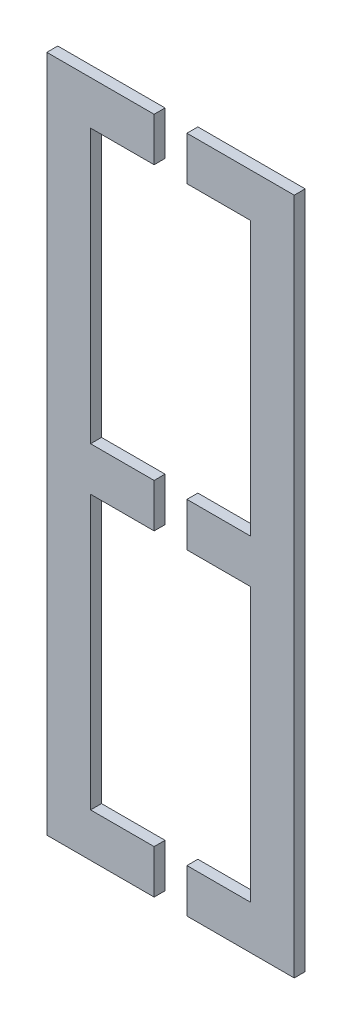
ISO-10303-21;
HEADER;
FILE_DESCRIPTION(('STEP AP214'),'2;1');
FILE_NAME('part.step','',(''),(''),'','','');
FILE_SCHEMA(('AUTOMOTIVE_DESIGN { 1 0 10303 214 1 1 1 1 }'));
ENDSEC;
DATA;
#1=APPLICATION_CONTEXT('core data for automotive mechanical design processes');
#2=APPLICATION_PROTOCOL_DEFINITION('international standard','automotive_design',2000,#1);
#3=PRODUCT_CONTEXT('',#1,'mechanical');
#4=PRODUCT('Part','Part','',(#3));
#5=PRODUCT_RELATED_PRODUCT_CATEGORY('part','',(#4));
#6=PRODUCT_DEFINITION_FORMATION('','',#4);
#7=PRODUCT_DEFINITION_CONTEXT('part definition',#1,'design');
#8=PRODUCT_DEFINITION('design','',#6,#7);
#9=PRODUCT_DEFINITION_SHAPE('','',#8);
#10=(LENGTH_UNIT() NAMED_UNIT(*) SI_UNIT(.MILLI.,.METRE.));
#11=(NAMED_UNIT(*) PLANE_ANGLE_UNIT() SI_UNIT($,.RADIAN.));
#12=(NAMED_UNIT(*) SI_UNIT($,.STERADIAN.) SOLID_ANGLE_UNIT());
#13=UNCERTAINTY_MEASURE_WITH_UNIT(LENGTH_MEASURE(1.E-05),#10,'distance_accuracy_value','');
#14=(GEOMETRIC_REPRESENTATION_CONTEXT(3) GLOBAL_UNCERTAINTY_ASSIGNED_CONTEXT((#13)) GLOBAL_UNIT_ASSIGNED_CONTEXT((#10,
#11,#12)) REPRESENTATION_CONTEXT('',''));
#15=CARTESIAN_POINT('',(0.,0.,0.));
#16=DIRECTION('',(0.,0.,1.));
#17=DIRECTION('',(1.,0.,0.));
#18=AXIS2_PLACEMENT_3D('',#15,#16,#17);
#19=CARTESIAN_POINT('',(118.250000228,184.12500005,6.35));
#20=DIRECTION('',(0.,1.,0.));
#21=DIRECTION('',(0.,0.,1.));
#22=AXIS2_PLACEMENT_3D('',#19,#20,#21);
#23=PLANE('',#22);
#24=DIRECTION('',(1.,0.,0.));
#25=VECTOR('',#24,1.);
#26=CARTESIAN_POINT('',(118.250000228,184.12500005,0.));
#27=LINE('',#26,#25);
#28=CARTESIAN_POINT('',(81.350000114,184.12500005,0.));
#29=VERTEX_POINT('',#28);
#30=CARTESIAN_POINT('',(118.250000228,184.12500005,0.));
#31=VERTEX_POINT('',#30);
#32=EDGE_CURVE('E163',#29,#31,#27,.T.);
#33=ORIENTED_EDGE('',*,*,#32,.T.);
#34=DIRECTION('',(0.,0.,-1.));
#35=VECTOR('',#34,1.);
#36=CARTESIAN_POINT('',(118.250000228,184.12500005,6.35));
#37=LINE('',#36,#35);
#38=CARTESIAN_POINT('',(118.250000228,184.12500005,6.35));
#39=VERTEX_POINT('',#38);
#40=EDGE_CURVE('E12',#39,#31,#37,.T.);
#41=ORIENTED_EDGE('',*,*,#40,.F.);
#42=DIRECTION('',(1.,0.,0.));
#43=VECTOR('',#42,1.);
#44=CARTESIAN_POINT('',(118.250000228,184.12500005,6.35));
#45=LINE('',#44,#43);
#46=CARTESIAN_POINT('',(81.350000114,184.12500005,6.35));
#47=VERTEX_POINT('',#46);
#48=EDGE_CURVE('E185',#47,#39,#45,.T.);
#49=ORIENTED_EDGE('',*,*,#48,.F.);
#50=DIRECTION('',(0.,0.,-1.));
#51=VECTOR('',#50,1.);
#52=CARTESIAN_POINT('',(81.350000114,184.12500005,6.35));
#53=LINE('',#52,#51);
#54=EDGE_CURVE('E159',#47,#29,#53,.T.);
#55=ORIENTED_EDGE('',*,*,#54,.T.);
#56=EDGE_LOOP('',(#33,#41,#49,#55));
#57=FACE_BOUND('',#56,.T.);
#58=ADVANCED_FACE('F43',(#57),#23,.F.);
#59=CARTESIAN_POINT('',(118.250000228,25.4,6.35));
#60=DIRECTION('',(1.,0.,0.));
#61=DIRECTION('',(0.,0.,-1.));
#62=AXIS2_PLACEMENT_3D('',#59,#60,#61);
#63=PLANE('',#62);
#64=DIRECTION('',(0.,-1.,0.));
#65=VECTOR('',#64,1.);
#66=CARTESIAN_POINT('',(118.250000228,25.4,0.));
#67=LINE('',#66,#65);
#68=CARTESIAN_POINT('',(118.250000228,25.4,0.));
#69=VERTEX_POINT('',#68);
#70=EDGE_CURVE('E166',#31,#69,#67,.T.);
#71=ORIENTED_EDGE('',*,*,#70,.T.);
#72=DIRECTION('',(0.,0.,-1.));
#73=VECTOR('',#72,1.);
#74=CARTESIAN_POINT('',(118.250000228,25.4,6.35));
#75=LINE('',#74,#73);
#76=CARTESIAN_POINT('',(118.250000228,25.4,6.35));
#77=VERTEX_POINT('',#76);
#78=EDGE_CURVE('E51',#77,#69,#75,.T.);
#79=ORIENTED_EDGE('',*,*,#78,.F.);
#80=DIRECTION('',(0.,-1.,0.));
#81=VECTOR('',#80,1.);
#82=CARTESIAN_POINT('',(118.250000228,25.4,6.35));
#83=LINE('',#82,#81);
#84=EDGE_CURVE('E114',#39,#77,#83,.T.);
#85=ORIENTED_EDGE('',*,*,#84,.F.);
#86=ORIENTED_EDGE('',*,*,#40,.T.);
#87=EDGE_LOOP('',(#71,#79,#85,#86));
#88=FACE_BOUND('',#87,.T.);
#89=ADVANCED_FACE('F263',(#88),#63,.F.);
#90=CARTESIAN_POINT('',(81.350000114,25.4,6.35));
#91=DIRECTION('',(0.,-1.,0.));
#92=DIRECTION('',(0.,0.,-1.));
#93=AXIS2_PLACEMENT_3D('',#90,#91,#92);
#94=PLANE('',#93);
#95=DIRECTION('',(-1.,0.,0.));
#96=VECTOR('',#95,1.);
#97=CARTESIAN_POINT('',(81.350000114,25.4,0.));
#98=LINE('',#97,#96);
#99=CARTESIAN_POINT('',(81.350000114,25.4,0.));
#100=VERTEX_POINT('',#99);
#101=EDGE_CURVE('E168',#69,#100,#98,.T.);
#102=ORIENTED_EDGE('',*,*,#101,.T.);
#103=DIRECTION('',(0.,0.,-1.));
#104=VECTOR('',#103,1.);
#105=CARTESIAN_POINT('',(81.350000114,25.4,6.35));
#106=LINE('',#105,#104);
#107=CARTESIAN_POINT('',(81.350000114,25.4,6.35));
#108=VERTEX_POINT('',#107);
#109=EDGE_CURVE('E204',#108,#100,#106,.T.);
#110=ORIENTED_EDGE('',*,*,#109,.F.);
#111=DIRECTION('',(-1.,0.,0.));
#112=VECTOR('',#111,1.);
#113=CARTESIAN_POINT('',(81.350000114,25.4,6.35));
#114=LINE('',#113,#112);
#115=EDGE_CURVE('E212',#77,#108,#114,.T.);
#116=ORIENTED_EDGE('',*,*,#115,.F.);
#117=ORIENTED_EDGE('',*,*,#78,.T.);
#118=EDGE_LOOP('',(#102,#110,#116,#117));
#119=FACE_BOUND('',#118,.T.);
#120=ADVANCED_FACE('F210',(#119),#94,.F.);
#121=CARTESIAN_POINT('',(81.350000114,0.,6.35));
#122=DIRECTION('',(1.,0.,0.));
#123=DIRECTION('',(0.,0.,-1.));
#124=AXIS2_PLACEMENT_3D('',#121,#122,#123);
#125=PLANE('',#124);
#126=DIRECTION('',(0.,-1.,0.));
#127=VECTOR('',#126,1.);
#128=CARTESIAN_POINT('',(81.350000114,0.,0.));
#129=LINE('',#128,#127);
#130=CARTESIAN_POINT('',(81.350000114,0.,0.));
#131=VERTEX_POINT('',#130);
#132=EDGE_CURVE('E170',#100,#131,#129,.T.);
#133=ORIENTED_EDGE('',*,*,#132,.T.);
#134=DIRECTION('',(0.,0.,-1.));
#135=VECTOR('',#134,1.);
#136=CARTESIAN_POINT('',(81.350000114,0.,6.35));
#137=LINE('',#136,#135);
#138=CARTESIAN_POINT('',(81.350000114,0.,6.35));
#139=VERTEX_POINT('',#138);
#140=EDGE_CURVE('E201',#139,#131,#137,.T.);
#141=ORIENTED_EDGE('',*,*,#140,.F.);
#142=DIRECTION('',(0.,-1.,0.));
#143=VECTOR('',#142,1.);
#144=CARTESIAN_POINT('',(81.350000114,0.,6.35));
#145=LINE('',#144,#143);
#146=EDGE_CURVE('E230',#108,#139,#145,.T.);
#147=ORIENTED_EDGE('',*,*,#146,.F.);
#148=ORIENTED_EDGE('',*,*,#109,.T.);
#149=EDGE_LOOP('',(#133,#141,#147,#148));
#150=FACE_BOUND('',#149,.T.);
#151=ADVANCED_FACE('F221',(#150),#125,.F.);
#152=CARTESIAN_POINT('',(143.650000228,0.,6.35));
#153=DIRECTION('',(0.,1.,0.));
#154=DIRECTION('',(0.,0.,1.));
#155=AXIS2_PLACEMENT_3D('',#152,#153,#154);
#156=PLANE('',#155);
#157=DIRECTION('',(1.,0.,0.));
#158=VECTOR('',#157,1.);
#159=CARTESIAN_POINT('',(143.650000228,0.,0.));
#160=LINE('',#159,#158);
#161=CARTESIAN_POINT('',(143.650000228,0.,0.));
#162=VERTEX_POINT('',#161);
#163=EDGE_CURVE('E172',#131,#162,#160,.T.);
#164=ORIENTED_EDGE('',*,*,#163,.T.);
#165=DIRECTION('',(0.,0.,-1.));
#166=VECTOR('',#165,1.);
#167=CARTESIAN_POINT('',(143.650000228,0.,6.35));
#168=LINE('',#167,#166);
#169=CARTESIAN_POINT('',(143.650000228,0.,6.35));
#170=VERTEX_POINT('',#169);
#171=EDGE_CURVE('E198',#170,#162,#168,.T.);
#172=ORIENTED_EDGE('',*,*,#171,.F.);
#173=DIRECTION('',(1.,0.,0.));
#174=VECTOR('',#173,1.);
#175=CARTESIAN_POINT('',(143.650000228,0.,6.35));
#176=LINE('',#175,#174);
#177=EDGE_CURVE('E227',#139,#170,#176,.T.);
#178=ORIENTED_EDGE('',*,*,#177,.F.);
#179=ORIENTED_EDGE('',*,*,#140,.T.);
#180=EDGE_LOOP('',(#164,#172,#178,#179));
#181=FACE_BOUND('',#180,.T.);
#182=ADVANCED_FACE('F225',(#181),#156,.F.);
#183=CARTESIAN_POINT('',(143.650000228,393.6500001,6.35));
#184=DIRECTION('',(-1.,0.,0.));
#185=DIRECTION('',(0.,0.,1.));
#186=AXIS2_PLACEMENT_3D('',#183,#184,#185);
#187=PLANE('',#186);
#188=DIRECTION('',(0.,1.,0.));
#189=VECTOR('',#188,1.);
#190=CARTESIAN_POINT('',(143.650000228,393.6500001,0.));
#191=LINE('',#190,#189);
#192=CARTESIAN_POINT('',(143.650000228,393.6500001,0.));
#193=VERTEX_POINT('',#192);
#194=EDGE_CURVE('E174',#162,#193,#191,.T.);
#195=ORIENTED_EDGE('',*,*,#194,.T.);
#196=DIRECTION('',(0.,0.,-1.));
#197=VECTOR('',#196,1.);
#198=CARTESIAN_POINT('',(143.650000228,393.6500001,6.35));
#199=LINE('',#198,#197);
#200=CARTESIAN_POINT('',(143.650000228,393.6500001,6.35));
#201=VERTEX_POINT('',#200);
#202=EDGE_CURVE('E195',#201,#193,#199,.T.);
#203=ORIENTED_EDGE('',*,*,#202,.F.);
#204=DIRECTION('',(0.,1.,0.));
#205=VECTOR('',#204,1.);
#206=CARTESIAN_POINT('',(143.650000228,393.6500001,6.35));
#207=LINE('',#206,#205);
#208=EDGE_CURVE('E229',#170,#201,#207,.T.);
#209=ORIENTED_EDGE('',*,*,#208,.F.);
#210=ORIENTED_EDGE('',*,*,#171,.T.);
#211=EDGE_LOOP('',(#195,#203,#209,#210));
#212=FACE_BOUND('',#211,.T.);
#213=ADVANCED_FACE('F276',(#212),#187,.F.);
#214=CARTESIAN_POINT('',(81.350000114,393.6500001,6.35));
#215=DIRECTION('',(0.,-1.,0.));
#216=DIRECTION('',(0.,0.,-1.));
#217=AXIS2_PLACEMENT_3D('',#214,#215,#216);
#218=PLANE('',#217);
#219=DIRECTION('',(-1.,0.,0.));
#220=VECTOR('',#219,1.);
#221=CARTESIAN_POINT('',(81.350000114,393.6500001,0.));
#222=LINE('',#221,#220);
#223=CARTESIAN_POINT('',(81.350000114,393.6500001,0.));
#224=VERTEX_POINT('',#223);
#225=EDGE_CURVE('E176',#193,#224,#222,.T.);
#226=ORIENTED_EDGE('',*,*,#225,.T.);
#227=DIRECTION('',(0.,0.,-1.));
#228=VECTOR('',#227,1.);
#229=CARTESIAN_POINT('',(81.350000114,393.6500001,6.35));
#230=LINE('',#229,#228);
#231=CARTESIAN_POINT('',(81.350000114,393.6500001,6.35));
#232=VERTEX_POINT('',#231);
#233=EDGE_CURVE('E192',#232,#224,#230,.T.);
#234=ORIENTED_EDGE('',*,*,#233,.F.);
#235=DIRECTION('',(-1.,0.,0.));
#236=VECTOR('',#235,1.);
#237=CARTESIAN_POINT('',(81.350000114,393.6500001,6.35));
#238=LINE('',#237,#236);
#239=EDGE_CURVE('E232',#201,#232,#238,.T.);
#240=ORIENTED_EDGE('',*,*,#239,.F.);
#241=ORIENTED_EDGE('',*,*,#202,.T.);
#242=EDGE_LOOP('',(#226,#234,#240,#241));
#243=FACE_BOUND('',#242,.T.);
#244=ADVANCED_FACE('F279',(#243),#218,.F.);
#245=CARTESIAN_POINT('',(81.350000114,368.2500001,6.35));
#246=DIRECTION('',(1.,0.,0.));
#247=DIRECTION('',(0.,0.,-1.));
#248=AXIS2_PLACEMENT_3D('',#245,#246,#247);
#249=PLANE('',#248);
#250=DIRECTION('',(0.,-1.,0.));
#251=VECTOR('',#250,1.);
#252=CARTESIAN_POINT('',(81.350000114,368.2500001,0.));
#253=LINE('',#252,#251);
#254=CARTESIAN_POINT('',(81.350000114,368.2500001,0.));
#255=VERTEX_POINT('',#254);
#256=EDGE_CURVE('E178',#224,#255,#253,.T.);
#257=ORIENTED_EDGE('',*,*,#256,.T.);
#258=DIRECTION('',(0.,0.,-1.));
#259=VECTOR('',#258,1.);
#260=CARTESIAN_POINT('',(81.350000114,368.2500001,6.35));
#261=LINE('',#260,#259);
#262=CARTESIAN_POINT('',(81.350000114,368.2500001,6.35));
#263=VERTEX_POINT('',#262);
#264=EDGE_CURVE('E189',#263,#255,#261,.T.);
#265=ORIENTED_EDGE('',*,*,#264,.F.);
#266=DIRECTION('',(0.,-1.,0.));
#267=VECTOR('',#266,1.);
#268=CARTESIAN_POINT('',(81.350000114,368.2500001,6.35));
#269=LINE('',#268,#267);
#270=EDGE_CURVE('E238',#232,#263,#269,.T.);
#271=ORIENTED_EDGE('',*,*,#270,.F.);
#272=ORIENTED_EDGE('',*,*,#233,.T.);
#273=EDGE_LOOP('',(#257,#265,#271,#272));
#274=FACE_BOUND('',#273,.T.);
#275=ADVANCED_FACE('F244',(#274),#249,.F.);
#276=CARTESIAN_POINT('',(118.250000228,368.2500001,6.35));
#277=DIRECTION('',(0.,1.,0.));
#278=DIRECTION('',(0.,0.,1.));
#279=AXIS2_PLACEMENT_3D('',#276,#277,#278);
#280=PLANE('',#279);
#281=DIRECTION('',(1.,0.,0.));
#282=VECTOR('',#281,1.);
#283=CARTESIAN_POINT('',(118.250000228,368.2500001,0.));
#284=LINE('',#283,#282);
#285=CARTESIAN_POINT('',(118.250000228,368.2500001,0.));
#286=VERTEX_POINT('',#285);
#287=EDGE_CURVE('E180',#255,#286,#284,.T.);
#288=ORIENTED_EDGE('',*,*,#287,.T.);
#289=DIRECTION('',(0.,0.,-1.));
#290=VECTOR('',#289,1.);
#291=CARTESIAN_POINT('',(118.250000228,368.2500001,6.35));
#292=LINE('',#291,#290);
#293=CARTESIAN_POINT('',(118.250000228,368.2500001,6.35));
#294=VERTEX_POINT('',#293);
#295=EDGE_CURVE('E154',#294,#286,#292,.T.);
#296=ORIENTED_EDGE('',*,*,#295,.F.);
#297=DIRECTION('',(1.,0.,0.));
#298=VECTOR('',#297,1.);
#299=CARTESIAN_POINT('',(118.250000228,368.2500001,6.35));
#300=LINE('',#299,#298);
#301=EDGE_CURVE('E145',#263,#294,#300,.T.);
#302=ORIENTED_EDGE('',*,*,#301,.F.);
#303=ORIENTED_EDGE('',*,*,#264,.T.);
#304=EDGE_LOOP('',(#288,#296,#302,#303));
#305=FACE_BOUND('',#304,.T.);
#306=ADVANCED_FACE('F248',(#305),#280,.F.);
#307=CARTESIAN_POINT('',(118.250000228,209.52500005,6.35));
#308=DIRECTION('',(1.,0.,0.));
#309=DIRECTION('',(0.,0.,-1.));
#310=AXIS2_PLACEMENT_3D('',#307,#308,#309);
#311=PLANE('',#310);
#312=DIRECTION('',(0.,-1.,0.));
#313=VECTOR('',#312,1.);
#314=CARTESIAN_POINT('',(118.250000228,209.52500005,0.));
#315=LINE('',#314,#313);
#316=CARTESIAN_POINT('',(118.250000228,209.52500005,0.));
#317=VERTEX_POINT('',#316);
#318=EDGE_CURVE('E153',#286,#317,#315,.T.);
#319=ORIENTED_EDGE('',*,*,#318,.T.);
#320=DIRECTION('',(0.,0.,-1.));
#321=VECTOR('',#320,1.);
#322=CARTESIAN_POINT('',(118.250000228,209.52500005,6.35));
#323=LINE('',#322,#321);
#324=CARTESIAN_POINT('',(118.250000228,209.52500005,6.35));
#325=VERTEX_POINT('',#324);
#326=EDGE_CURVE('E150',#325,#317,#323,.T.);
#327=ORIENTED_EDGE('',*,*,#326,.F.);
#328=DIRECTION('',(0.,-1.,0.));
#329=VECTOR('',#328,1.);
#330=CARTESIAN_POINT('',(118.250000228,209.52500005,6.35));
#331=LINE('',#330,#329);
#332=EDGE_CURVE('E139',#294,#325,#331,.T.);
#333=ORIENTED_EDGE('',*,*,#332,.F.);
#334=ORIENTED_EDGE('',*,*,#295,.T.);
#335=EDGE_LOOP('',(#319,#327,#333,#334));
#336=FACE_BOUND('',#335,.T.);
#337=ADVANCED_FACE('F151',(#336),#311,.F.);
#338=CARTESIAN_POINT('',(81.350000114,209.52500005,6.35));
#339=DIRECTION('',(0.,-1.,0.));
#340=DIRECTION('',(0.,0.,-1.));
#341=AXIS2_PLACEMENT_3D('',#338,#339,#340);
#342=PLANE('',#341);
#343=DIRECTION('',(-1.,0.,0.));
#344=VECTOR('',#343,1.);
#345=CARTESIAN_POINT('',(81.350000114,209.52500005,0.));
#346=LINE('',#345,#344);
#347=CARTESIAN_POINT('',(81.350000114,209.52500005,0.));
#348=VERTEX_POINT('',#347);
#349=EDGE_CURVE('E100',#317,#348,#346,.T.);
#350=ORIENTED_EDGE('',*,*,#349,.T.);
#351=DIRECTION('',(0.,0.,-1.));
#352=VECTOR('',#351,1.);
#353=CARTESIAN_POINT('',(81.350000114,209.52500005,6.35));
#354=LINE('',#353,#352);
#355=CARTESIAN_POINT('',(81.350000114,209.52500005,6.35));
#356=VERTEX_POINT('',#355);
#357=EDGE_CURVE('E155',#356,#348,#354,.T.);
#358=ORIENTED_EDGE('',*,*,#357,.F.);
#359=DIRECTION('',(-1.,0.,0.));
#360=VECTOR('',#359,1.);
#361=CARTESIAN_POINT('',(81.350000114,209.52500005,6.35));
#362=LINE('',#361,#360);
#363=EDGE_CURVE('E143',#325,#356,#362,.T.);
#364=ORIENTED_EDGE('',*,*,#363,.F.);
#365=ORIENTED_EDGE('',*,*,#326,.T.);
#366=EDGE_LOOP('',(#350,#358,#364,#365));
#367=FACE_BOUND('',#366,.T.);
#368=ADVANCED_FACE('F157',(#367),#342,.F.);
#369=CARTESIAN_POINT('',(81.350000114,184.12500005,6.35));
#370=DIRECTION('',(1.,0.,0.));
#371=DIRECTION('',(0.,0.,-1.));
#372=AXIS2_PLACEMENT_3D('',#369,#370,#371);
#373=PLANE('',#372);
#374=DIRECTION('',(0.,-1.,0.));
#375=VECTOR('',#374,1.);
#376=CARTESIAN_POINT('',(81.350000114,184.12500005,0.));
#377=LINE('',#376,#375);
#378=EDGE_CURVE('E106',#348,#29,#377,.T.);
#379=ORIENTED_EDGE('',*,*,#378,.T.);
#380=ORIENTED_EDGE('',*,*,#54,.F.);
#381=DIRECTION('',(0.,-1.,0.));
#382=VECTOR('',#381,1.);
#383=CARTESIAN_POINT('',(81.350000114,184.12500005,6.35));
#384=LINE('',#383,#382);
#385=EDGE_CURVE('E59',#356,#47,#384,.T.);
#386=ORIENTED_EDGE('',*,*,#385,.F.);
#387=ORIENTED_EDGE('',*,*,#357,.T.);
#388=EDGE_LOOP('',(#379,#380,#386,#387));
#389=FACE_BOUND('',#388,.T.);
#390=ADVANCED_FACE('F252',(#389),#373,.F.);
#391=CARTESIAN_POINT('',(0.,0.,6.35));
#392=DIRECTION('',(0.,0.,-1.));
#393=DIRECTION('',(-1.,0.,0.));
#394=AXIS2_PLACEMENT_3D('',#391,#392,#393);
#395=PLANE('',#394);
#396=ORIENTED_EDGE('',*,*,#48,.T.);
#397=ORIENTED_EDGE('',*,*,#84,.T.);
#398=ORIENTED_EDGE('',*,*,#115,.T.);
#399=ORIENTED_EDGE('',*,*,#146,.T.);
#400=ORIENTED_EDGE('',*,*,#177,.T.);
#401=ORIENTED_EDGE('',*,*,#208,.T.);
#402=ORIENTED_EDGE('',*,*,#239,.T.);
#403=ORIENTED_EDGE('',*,*,#270,.T.);
#404=ORIENTED_EDGE('',*,*,#301,.T.);
#405=ORIENTED_EDGE('',*,*,#332,.T.);
#406=ORIENTED_EDGE('',*,*,#363,.T.);
#407=ORIENTED_EDGE('',*,*,#385,.T.);
#408=EDGE_LOOP('',(#396,#397,#398,#399,#400,#401,#402,#403,#404,#405,#406,#407));
#409=FACE_BOUND('',#408,.T.);
#410=ADVANCED_FACE('F141',(#409),#395,.F.);
#411=CARTESIAN_POINT('',(0.,0.,0.));
#412=DIRECTION('',(0.,0.,-1.));
#413=DIRECTION('',(-1.,0.,0.));
#414=AXIS2_PLACEMENT_3D('',#411,#412,#413);
#415=PLANE('',#414);
#416=ORIENTED_EDGE('',*,*,#32,.F.);
#417=ORIENTED_EDGE('',*,*,#378,.F.);
#418=ORIENTED_EDGE('',*,*,#349,.F.);
#419=ORIENTED_EDGE('',*,*,#318,.F.);
#420=ORIENTED_EDGE('',*,*,#287,.F.);
#421=ORIENTED_EDGE('',*,*,#256,.F.);
#422=ORIENTED_EDGE('',*,*,#225,.F.);
#423=ORIENTED_EDGE('',*,*,#194,.F.);
#424=ORIENTED_EDGE('',*,*,#163,.F.);
#425=ORIENTED_EDGE('',*,*,#132,.F.);
#426=ORIENTED_EDGE('',*,*,#101,.F.);
#427=ORIENTED_EDGE('',*,*,#70,.F.);
#428=EDGE_LOOP('',(#416,#417,#418,#419,#420,#421,#422,#423,#424,#425,#426,#427));
#429=FACE_BOUND('',#428,.T.);
#430=ADVANCED_FACE('F216',(#429),#415,.T.);
#431=CLOSED_SHELL('',(#58,#89,#120,#151,#182,#213,#244,#275,#306,#337,#368,#390,#410,#430));
#432=MANIFOLD_SOLID_BREP('B2',#431);
#433=CARTESIAN_POINT('',(0.,393.6500001,6.35));
#434=DIRECTION('',(1.,0.,0.));
#435=DIRECTION('',(0.,0.,-1.));
#436=AXIS2_PLACEMENT_3D('',#433,#434,#435);
#437=PLANE('',#436);
#438=DIRECTION('',(0.,-1.,0.));
#439=VECTOR('',#438,1.);
#440=CARTESIAN_POINT('',(0.,393.6500001,0.));
#441=LINE('',#440,#439);
#442=CARTESIAN_POINT('',(0.,393.6500001,0.));
#443=VERTEX_POINT('',#442);
#444=CARTESIAN_POINT('',(0.,0.,0.));
#445=VERTEX_POINT('',#444);
#446=EDGE_CURVE('E495',#443,#445,#441,.T.);
#447=ORIENTED_EDGE('',*,*,#446,.T.);
#448=DIRECTION('',(0.,0.,-1.));
#449=VECTOR('',#448,1.);
#450=CARTESIAN_POINT('',(0.,0.,6.35));
#451=LINE('',#450,#449);
#452=CARTESIAN_POINT('',(0.,0.,6.35));
#453=VERTEX_POINT('',#452);
#454=EDGE_CURVE('E41',#453,#445,#451,.T.);
#455=ORIENTED_EDGE('',*,*,#454,.F.);
#456=DIRECTION('',(0.,-1.,0.));
#457=VECTOR('',#456,1.);
#458=CARTESIAN_POINT('',(0.,393.6500001,6.35));
#459=LINE('',#458,#457);
#460=CARTESIAN_POINT('',(0.,393.6500001,6.35));
#461=VERTEX_POINT('',#460);
#462=EDGE_CURVE('E517',#461,#453,#459,.T.);
#463=ORIENTED_EDGE('',*,*,#462,.F.);
#464=DIRECTION('',(0.,0.,-1.));
#465=VECTOR('',#464,1.);
#466=CARTESIAN_POINT('',(0.,393.6500001,6.35));
#467=LINE('',#466,#465);
#468=EDGE_CURVE('E491',#461,#443,#467,.T.);
#469=ORIENTED_EDGE('',*,*,#468,.T.);
#470=EDGE_LOOP('',(#447,#455,#463,#469));
#471=FACE_BOUND('',#470,.T.);
#472=ADVANCED_FACE('F375',(#471),#437,.F.);
#473=CARTESIAN_POINT('',(0.,0.,6.35));
#474=DIRECTION('',(0.,1.,0.));
#475=DIRECTION('',(0.,0.,1.));
#476=AXIS2_PLACEMENT_3D('',#473,#474,#475);
#477=PLANE('',#476);
#478=DIRECTION('',(1.,0.,0.));
#479=VECTOR('',#478,1.);
#480=CARTESIAN_POINT('',(0.,0.,0.));
#481=LINE('',#480,#479);
#482=CARTESIAN_POINT('',(62.300000114,0.,0.));
#483=VERTEX_POINT('',#482);
#484=EDGE_CURVE('E498',#445,#483,#481,.T.);
#485=ORIENTED_EDGE('',*,*,#484,.T.);
#486=DIRECTION('',(0.,0.,-1.));
#487=VECTOR('',#486,1.);
#488=CARTESIAN_POINT('',(62.300000114,0.,6.35));
#489=LINE('',#488,#487);
#490=CARTESIAN_POINT('',(62.300000114,0.,6.35));
#491=VERTEX_POINT('',#490);
#492=EDGE_CURVE('E383',#491,#483,#489,.T.);
#493=ORIENTED_EDGE('',*,*,#492,.F.);
#494=DIRECTION('',(1.,0.,0.));
#495=VECTOR('',#494,1.);
#496=CARTESIAN_POINT('',(0.,0.,6.35));
#497=LINE('',#496,#495);
#498=EDGE_CURVE('E446',#453,#491,#497,.T.);
#499=ORIENTED_EDGE('',*,*,#498,.F.);
#500=ORIENTED_EDGE('',*,*,#454,.T.);
#501=EDGE_LOOP('',(#485,#493,#499,#500));
#502=FACE_BOUND('',#501,.T.);
#503=ADVANCED_FACE('F595',(#502),#477,.F.);
#504=CARTESIAN_POINT('',(62.300000114,0.,6.35));
#505=DIRECTION('',(-1.,0.,0.));
#506=DIRECTION('',(0.,0.,1.));
#507=AXIS2_PLACEMENT_3D('',#504,#505,#506);
#508=PLANE('',#507);
#509=DIRECTION('',(0.,1.,0.));
#510=VECTOR('',#509,1.);
#511=CARTESIAN_POINT('',(62.300000114,0.,0.));
#512=LINE('',#511,#510);
#513=CARTESIAN_POINT('',(62.300000114,25.4,0.));
#514=VERTEX_POINT('',#513);
#515=EDGE_CURVE('E500',#483,#514,#512,.T.);
#516=ORIENTED_EDGE('',*,*,#515,.T.);
#517=DIRECTION('',(0.,0.,-1.));
#518=VECTOR('',#517,1.);
#519=CARTESIAN_POINT('',(62.300000114,25.4,6.35));
#520=LINE('',#519,#518);
#521=CARTESIAN_POINT('',(62.300000114,25.4,6.35));
#522=VERTEX_POINT('',#521);
#523=EDGE_CURVE('E536',#522,#514,#520,.T.);
#524=ORIENTED_EDGE('',*,*,#523,.F.);
#525=DIRECTION('',(0.,1.,0.));
#526=VECTOR('',#525,1.);
#527=CARTESIAN_POINT('',(62.300000114,0.,6.35));
#528=LINE('',#527,#526);
#529=EDGE_CURVE('E544',#491,#522,#528,.T.);
#530=ORIENTED_EDGE('',*,*,#529,.F.);
#531=ORIENTED_EDGE('',*,*,#492,.T.);
#532=EDGE_LOOP('',(#516,#524,#530,#531));
#533=FACE_BOUND('',#532,.T.);
#534=ADVANCED_FACE('F542',(#533),#508,.F.);
#535=CARTESIAN_POINT('',(62.300000114,25.4,6.35));
#536=DIRECTION('',(0.,-1.,0.));
#537=DIRECTION('',(1.,0.,0.));
#538=AXIS2_PLACEMENT_3D('',#535,#536,#537);
#539=PLANE('',#538);
#540=DIRECTION('',(-1.,0.,0.));
#541=VECTOR('',#540,1.);
#542=CARTESIAN_POINT('',(62.300000114,25.4,0.));
#543=LINE('',#542,#541);
#544=CARTESIAN_POINT('',(25.4,25.4,0.));
#545=VERTEX_POINT('',#544);
#546=EDGE_CURVE('E502',#514,#545,#543,.T.);
#547=ORIENTED_EDGE('',*,*,#546,.T.);
#548=DIRECTION('',(0.,0.,-1.));
#549=VECTOR('',#548,1.);
#550=CARTESIAN_POINT('',(25.4,25.4,6.35));
#551=LINE('',#550,#549);
#552=CARTESIAN_POINT('',(25.4,25.4,6.35));
#553=VERTEX_POINT('',#552);
#554=EDGE_CURVE('E533',#553,#545,#551,.T.);
#555=ORIENTED_EDGE('',*,*,#554,.F.);
#556=DIRECTION('',(-1.,0.,0.));
#557=VECTOR('',#556,1.);
#558=CARTESIAN_POINT('',(62.300000114,25.4,6.35));
#559=LINE('',#558,#557);
#560=EDGE_CURVE('E562',#522,#553,#559,.T.);
#561=ORIENTED_EDGE('',*,*,#560,.F.);
#562=ORIENTED_EDGE('',*,*,#523,.T.);
#563=EDGE_LOOP('',(#547,#555,#561,#562));
#564=FACE_BOUND('',#563,.T.);
#565=ADVANCED_FACE('F553',(#564),#539,.F.);
#566=CARTESIAN_POINT('',(25.4,25.4,6.35));
#567=DIRECTION('',(-1.,0.,0.));
#568=DIRECTION('',(0.,-1.,0.));
#569=AXIS2_PLACEMENT_3D('',#566,#567,#568);
#570=PLANE('',#569);
#571=DIRECTION('',(0.,1.,0.));
#572=VECTOR('',#571,1.);
#573=CARTESIAN_POINT('',(25.4,25.4,0.));
#574=LINE('',#573,#572);
#575=CARTESIAN_POINT('',(25.4,184.12500005,0.));
#576=VERTEX_POINT('',#575);
#577=EDGE_CURVE('E504',#545,#576,#574,.T.);
#578=ORIENTED_EDGE('',*,*,#577,.T.);
#579=DIRECTION('',(0.,0.,-1.));
#580=VECTOR('',#579,1.);
#581=CARTESIAN_POINT('',(25.4,184.12500005,6.35));
#582=LINE('',#581,#580);
#583=CARTESIAN_POINT('',(25.4,184.12500005,6.35));
#584=VERTEX_POINT('',#583);
#585=EDGE_CURVE('E530',#584,#576,#582,.T.);
#586=ORIENTED_EDGE('',*,*,#585,.F.);
#587=DIRECTION('',(0.,1.,0.));
#588=VECTOR('',#587,1.);
#589=CARTESIAN_POINT('',(25.4,25.4,6.35));
#590=LINE('',#589,#588);
#591=EDGE_CURVE('E559',#553,#584,#590,.T.);
#592=ORIENTED_EDGE('',*,*,#591,.F.);
#593=ORIENTED_EDGE('',*,*,#554,.T.);
#594=EDGE_LOOP('',(#578,#586,#592,#593));
#595=FACE_BOUND('',#594,.T.);
#596=ADVANCED_FACE('F557',(#595),#570,.F.);
#597=CARTESIAN_POINT('',(25.4,184.12500005,6.35));
#598=DIRECTION('',(0.,1.,0.));
#599=DIRECTION('',(0.,0.,1.));
#600=AXIS2_PLACEMENT_3D('',#597,#598,#599);
#601=PLANE('',#600);
#602=DIRECTION('',(1.,0.,0.));
#603=VECTOR('',#602,1.);
#604=CARTESIAN_POINT('',(25.4,184.12500005,0.));
#605=LINE('',#604,#603);
#606=CARTESIAN_POINT('',(62.300000114,184.12500005,0.));
#607=VERTEX_POINT('',#606);
#608=EDGE_CURVE('E506',#576,#607,#605,.T.);
#609=ORIENTED_EDGE('',*,*,#608,.T.);
#610=DIRECTION('',(0.,0.,-1.));
#611=VECTOR('',#610,1.);
#612=CARTESIAN_POINT('',(62.300000114,184.12500005,6.35));
#613=LINE('',#612,#611);
#614=CARTESIAN_POINT('',(62.300000114,184.12500005,6.35));
#615=VERTEX_POINT('',#614);
#616=EDGE_CURVE('E527',#615,#607,#613,.T.);
#617=ORIENTED_EDGE('',*,*,#616,.F.);
#618=DIRECTION('',(1.,0.,0.));
#619=VECTOR('',#618,1.);
#620=CARTESIAN_POINT('',(25.4,184.12500005,6.35));
#621=LINE('',#620,#619);
#622=EDGE_CURVE('E561',#584,#615,#621,.T.);
#623=ORIENTED_EDGE('',*,*,#622,.F.);
#624=ORIENTED_EDGE('',*,*,#585,.T.);
#625=EDGE_LOOP('',(#609,#617,#623,#624));
#626=FACE_BOUND('',#625,.T.);
#627=ADVANCED_FACE('F608',(#626),#601,.F.);
#628=CARTESIAN_POINT('',(62.300000114,184.12500005,6.35));
#629=DIRECTION('',(-1.,0.,0.));
#630=DIRECTION('',(0.,0.,1.));
#631=AXIS2_PLACEMENT_3D('',#628,#629,#630);
#632=PLANE('',#631);
#633=DIRECTION('',(0.,1.,0.));
#634=VECTOR('',#633,1.);
#635=CARTESIAN_POINT('',(62.300000114,184.12500005,0.));
#636=LINE('',#635,#634);
#637=CARTESIAN_POINT('',(62.300000114,209.52500005,0.));
#638=VERTEX_POINT('',#637);
#639=EDGE_CURVE('E508',#607,#638,#636,.T.);
#640=ORIENTED_EDGE('',*,*,#639,.T.);
#641=DIRECTION('',(0.,0.,-1.));
#642=VECTOR('',#641,1.);
#643=CARTESIAN_POINT('',(62.300000114,209.52500005,6.35));
#644=LINE('',#643,#642);
#645=CARTESIAN_POINT('',(62.300000114,209.52500005,6.35));
#646=VERTEX_POINT('',#645);
#647=EDGE_CURVE('E524',#646,#638,#644,.T.);
#648=ORIENTED_EDGE('',*,*,#647,.F.);
#649=DIRECTION('',(0.,1.,0.));
#650=VECTOR('',#649,1.);
#651=CARTESIAN_POINT('',(62.300000114,184.12500005,6.35));
#652=LINE('',#651,#650);
#653=EDGE_CURVE('E564',#615,#646,#652,.T.);
#654=ORIENTED_EDGE('',*,*,#653,.F.);
#655=ORIENTED_EDGE('',*,*,#616,.T.);
#656=EDGE_LOOP('',(#640,#648,#654,#655));
#657=FACE_BOUND('',#656,.T.);
#658=ADVANCED_FACE('F611',(#657),#632,.F.);
#659=CARTESIAN_POINT('',(62.300000114,209.52500005,6.35));
#660=DIRECTION('',(0.,-1.,0.));
#661=DIRECTION('',(0.,0.,-1.));
#662=AXIS2_PLACEMENT_3D('',#659,#660,#661);
#663=PLANE('',#662);
#664=DIRECTION('',(-1.,0.,0.));
#665=VECTOR('',#664,1.);
#666=CARTESIAN_POINT('',(62.300000114,209.52500005,0.));
#667=LINE('',#666,#665);
#668=CARTESIAN_POINT('',(25.4,209.52500005,0.));
#669=VERTEX_POINT('',#668);
#670=EDGE_CURVE('E510',#638,#669,#667,.T.);
#671=ORIENTED_EDGE('',*,*,#670,.T.);
#672=DIRECTION('',(0.,0.,-1.));
#673=VECTOR('',#672,1.);
#674=CARTESIAN_POINT('',(25.4,209.52500005,6.35));
#675=LINE('',#674,#673);
#676=CARTESIAN_POINT('',(25.4,209.52500005,6.35));
#677=VERTEX_POINT('',#676);
#678=EDGE_CURVE('E521',#677,#669,#675,.T.);
#679=ORIENTED_EDGE('',*,*,#678,.F.);
#680=DIRECTION('',(-1.,0.,0.));
#681=VECTOR('',#680,1.);
#682=CARTESIAN_POINT('',(62.300000114,209.52500005,6.35));
#683=LINE('',#682,#681);
#684=EDGE_CURVE('E570',#646,#677,#683,.T.);
#685=ORIENTED_EDGE('',*,*,#684,.F.);
#686=ORIENTED_EDGE('',*,*,#647,.T.);
#687=EDGE_LOOP('',(#671,#679,#685,#686));
#688=FACE_BOUND('',#687,.T.);
#689=ADVANCED_FACE('F576',(#688),#663,.F.);
#690=CARTESIAN_POINT('',(25.4,209.52500005,6.35));
#691=DIRECTION('',(-1.,0.,0.));
#692=DIRECTION('',(0.,0.,1.));
#693=AXIS2_PLACEMENT_3D('',#690,#691,#692);
#694=PLANE('',#693);
#695=DIRECTION('',(0.,1.,0.));
#696=VECTOR('',#695,1.);
#697=CARTESIAN_POINT('',(25.4,209.52500005,0.));
#698=LINE('',#697,#696);
#699=CARTESIAN_POINT('',(25.4,368.2500001,0.));
#700=VERTEX_POINT('',#699);
#701=EDGE_CURVE('E512',#669,#700,#698,.T.);
#702=ORIENTED_EDGE('',*,*,#701,.T.);
#703=DIRECTION('',(0.,0.,-1.));
#704=VECTOR('',#703,1.);
#705=CARTESIAN_POINT('',(25.4,368.2500001,6.35));
#706=LINE('',#705,#704);
#707=CARTESIAN_POINT('',(25.4,368.2500001,6.35));
#708=VERTEX_POINT('',#707);
#709=EDGE_CURVE('E486',#708,#700,#706,.T.);
#710=ORIENTED_EDGE('',*,*,#709,.F.);
#711=DIRECTION('',(0.,1.,0.));
#712=VECTOR('',#711,1.);
#713=CARTESIAN_POINT('',(25.4,209.52500005,6.35));
#714=LINE('',#713,#712);
#715=EDGE_CURVE('E477',#677,#708,#714,.T.);
#716=ORIENTED_EDGE('',*,*,#715,.F.);
#717=ORIENTED_EDGE('',*,*,#678,.T.);
#718=EDGE_LOOP('',(#702,#710,#716,#717));
#719=FACE_BOUND('',#718,.T.);
#720=ADVANCED_FACE('F580',(#719),#694,.F.);
#721=CARTESIAN_POINT('',(25.4,368.2500001,6.35));
#722=DIRECTION('',(0.,1.,0.));
#723=DIRECTION('',(0.,0.,1.));
#724=AXIS2_PLACEMENT_3D('',#721,#722,#723);
#725=PLANE('',#724);
#726=DIRECTION('',(1.,0.,0.));
#727=VECTOR('',#726,1.);
#728=CARTESIAN_POINT('',(25.4,368.2500001,0.));
#729=LINE('',#728,#727);
#730=CARTESIAN_POINT('',(62.300000114,368.2500001,0.));
#731=VERTEX_POINT('',#730);
#732=EDGE_CURVE('E485',#700,#731,#729,.T.);
#733=ORIENTED_EDGE('',*,*,#732,.T.);
#734=DIRECTION('',(0.,0.,-1.));
#735=VECTOR('',#734,1.);
#736=CARTESIAN_POINT('',(62.300000114,368.2500001,6.35));
#737=LINE('',#736,#735);
#738=CARTESIAN_POINT('',(62.300000114,368.2500001,6.35));
#739=VERTEX_POINT('',#738);
#740=EDGE_CURVE('E482',#739,#731,#737,.T.);
#741=ORIENTED_EDGE('',*,*,#740,.F.);
#742=DIRECTION('',(1.,0.,0.));
#743=VECTOR('',#742,1.);
#744=CARTESIAN_POINT('',(25.4,368.2500001,6.35));
#745=LINE('',#744,#743);
#746=EDGE_CURVE('E471',#708,#739,#745,.T.);
#747=ORIENTED_EDGE('',*,*,#746,.F.);
#748=ORIENTED_EDGE('',*,*,#709,.T.);
#749=EDGE_LOOP('',(#733,#741,#747,#748));
#750=FACE_BOUND('',#749,.T.);
#751=ADVANCED_FACE('F483',(#750),#725,.F.);
#752=CARTESIAN_POINT('',(62.300000114,368.2500001,6.35));
#753=DIRECTION('',(-1.,0.,0.));
#754=DIRECTION('',(0.,0.,1.));
#755=AXIS2_PLACEMENT_3D('',#752,#753,#754);
#756=PLANE('',#755);
#757=DIRECTION('',(0.,1.,0.));
#758=VECTOR('',#757,1.);
#759=CARTESIAN_POINT('',(62.300000114,368.2500001,0.));
#760=LINE('',#759,#758);
#761=CARTESIAN_POINT('',(62.300000114,393.6500001,0.));
#762=VERTEX_POINT('',#761);
#763=EDGE_CURVE('E432',#731,#762,#760,.T.);
#764=ORIENTED_EDGE('',*,*,#763,.T.);
#765=DIRECTION('',(0.,0.,-1.));
#766=VECTOR('',#765,1.);
#767=CARTESIAN_POINT('',(62.300000114,393.6500001,6.35));
#768=LINE('',#767,#766);
#769=CARTESIAN_POINT('',(62.300000114,393.6500001,6.35));
#770=VERTEX_POINT('',#769);
#771=EDGE_CURVE('E487',#770,#762,#768,.T.);
#772=ORIENTED_EDGE('',*,*,#771,.F.);
#773=DIRECTION('',(0.,1.,0.));
#774=VECTOR('',#773,1.);
#775=CARTESIAN_POINT('',(62.300000114,368.2500001,6.35));
#776=LINE('',#775,#774);
#777=EDGE_CURVE('E475',#739,#770,#776,.T.);
#778=ORIENTED_EDGE('',*,*,#777,.F.);
#779=ORIENTED_EDGE('',*,*,#740,.T.);
#780=EDGE_LOOP('',(#764,#772,#778,#779));
#781=FACE_BOUND('',#780,.T.);
#782=ADVANCED_FACE('F489',(#781),#756,.F.);
#783=CARTESIAN_POINT('',(62.300000114,393.6500001,6.35));
#784=DIRECTION('',(0.,-1.,0.));
#785=DIRECTION('',(0.,0.,-1.));
#786=AXIS2_PLACEMENT_3D('',#783,#784,#785);
#787=PLANE('',#786);
#788=DIRECTION('',(-1.,0.,0.));
#789=VECTOR('',#788,1.);
#790=CARTESIAN_POINT('',(62.300000114,393.6500001,0.));
#791=LINE('',#790,#789);
#792=EDGE_CURVE('E438',#762,#443,#791,.T.);
#793=ORIENTED_EDGE('',*,*,#792,.T.);
#794=ORIENTED_EDGE('',*,*,#468,.F.);
#795=DIRECTION('',(-1.,0.,0.));
#796=VECTOR('',#795,1.);
#797=CARTESIAN_POINT('',(62.300000114,393.6500001,6.35));
#798=LINE('',#797,#796);
#799=EDGE_CURVE('E391',#770,#461,#798,.T.);
#800=ORIENTED_EDGE('',*,*,#799,.F.);
#801=ORIENTED_EDGE('',*,*,#771,.T.);
#802=EDGE_LOOP('',(#793,#794,#800,#801));
#803=FACE_BOUND('',#802,.T.);
#804=ADVANCED_FACE('F584',(#803),#787,.F.);
#805=CARTESIAN_POINT('',(0.,0.,6.35));
#806=DIRECTION('',(0.,0.,1.));
#807=DIRECTION('',(1.,0.,0.));
#808=AXIS2_PLACEMENT_3D('',#805,#806,#807);
#809=PLANE('',#808);
#810=ORIENTED_EDGE('',*,*,#462,.T.);
#811=ORIENTED_EDGE('',*,*,#498,.T.);
#812=ORIENTED_EDGE('',*,*,#529,.T.);
#813=ORIENTED_EDGE('',*,*,#560,.T.);
#814=ORIENTED_EDGE('',*,*,#591,.T.);
#815=ORIENTED_EDGE('',*,*,#622,.T.);
#816=ORIENTED_EDGE('',*,*,#653,.T.);
#817=ORIENTED_EDGE('',*,*,#684,.T.);
#818=ORIENTED_EDGE('',*,*,#715,.T.);
#819=ORIENTED_EDGE('',*,*,#746,.T.);
#820=ORIENTED_EDGE('',*,*,#777,.T.);
#821=ORIENTED_EDGE('',*,*,#799,.T.);
#822=EDGE_LOOP('',(#810,#811,#812,#813,#814,#815,#816,#817,#818,#819,#820,#821));
#823=FACE_BOUND('',#822,.T.);
#824=ADVANCED_FACE('F473',(#823),#809,.T.);
#825=CARTESIAN_POINT('',(0.,0.,0.));
#826=DIRECTION('',(0.,0.,1.));
#827=DIRECTION('',(1.,0.,0.));
#828=AXIS2_PLACEMENT_3D('',#825,#826,#827);
#829=PLANE('',#828);
#830=ORIENTED_EDGE('',*,*,#446,.F.);
#831=ORIENTED_EDGE('',*,*,#792,.F.);
#832=ORIENTED_EDGE('',*,*,#763,.F.);
#833=ORIENTED_EDGE('',*,*,#732,.F.);
#834=ORIENTED_EDGE('',*,*,#701,.F.);
#835=ORIENTED_EDGE('',*,*,#670,.F.);
#836=ORIENTED_EDGE('',*,*,#639,.F.);
#837=ORIENTED_EDGE('',*,*,#608,.F.);
#838=ORIENTED_EDGE('',*,*,#577,.F.);
#839=ORIENTED_EDGE('',*,*,#546,.F.);
#840=ORIENTED_EDGE('',*,*,#515,.F.);
#841=ORIENTED_EDGE('',*,*,#484,.F.);
#842=EDGE_LOOP('',(#830,#831,#832,#833,#834,#835,#836,#837,#838,#839,#840,#841));
#843=FACE_BOUND('',#842,.T.);
#844=ADVANCED_FACE('F548',(#843),#829,.F.);
#845=CLOSED_SHELL('',(#472,#503,#534,#565,#596,#627,#658,#689,#720,#751,#782,#804,#824,#844));
#846=MANIFOLD_SOLID_BREP('B6',#845);
#847=ADVANCED_BREP_SHAPE_REPRESENTATION('',(#18,#432,#846),#14);
#848=SHAPE_DEFINITION_REPRESENTATION(#9,#847);
ENDSEC;
END-ISO-10303-21;
